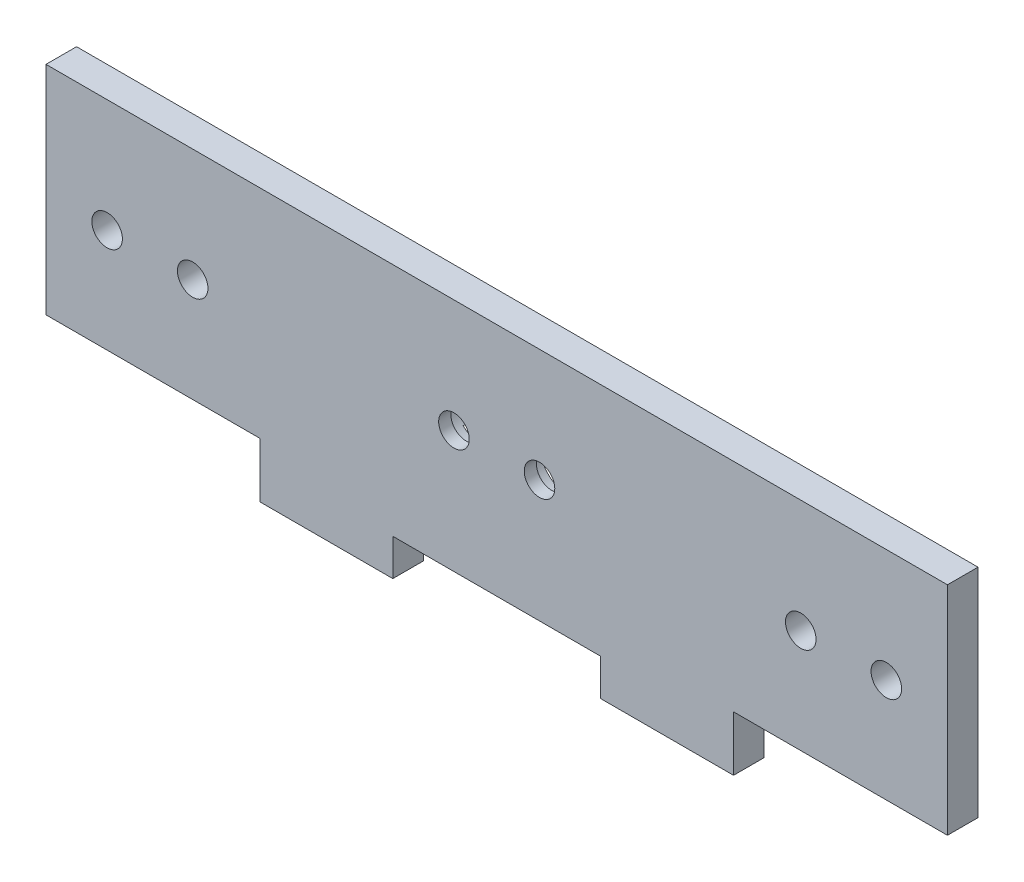
ISO-10303-21;
HEADER;
FILE_DESCRIPTION(('STEP AP214'),'2;1');
FILE_NAME('part.step','',(''),(''),'','','');
FILE_SCHEMA(('AUTOMOTIVE_DESIGN { 1 0 10303 214 1 1 1 1 }'));
ENDSEC;
DATA;
#1=APPLICATION_CONTEXT('core data for automotive mechanical design processes');
#2=APPLICATION_PROTOCOL_DEFINITION('international standard','automotive_design',2000,#1);
#3=PRODUCT_CONTEXT('',#1,'mechanical');
#4=PRODUCT('Part','Part','',(#3));
#5=PRODUCT_RELATED_PRODUCT_CATEGORY('part','',(#4));
#6=PRODUCT_DEFINITION_FORMATION('','',#4);
#7=PRODUCT_DEFINITION_CONTEXT('part definition',#1,'design');
#8=PRODUCT_DEFINITION('design','',#6,#7);
#9=PRODUCT_DEFINITION_SHAPE('','',#8);
#10=(LENGTH_UNIT() NAMED_UNIT(*) SI_UNIT(.MILLI.,.METRE.));
#11=(NAMED_UNIT(*) PLANE_ANGLE_UNIT() SI_UNIT($,.RADIAN.));
#12=(NAMED_UNIT(*) SI_UNIT($,.STERADIAN.) SOLID_ANGLE_UNIT());
#13=UNCERTAINTY_MEASURE_WITH_UNIT(LENGTH_MEASURE(1.E-05),#10,'distance_accuracy_value','');
#14=(GEOMETRIC_REPRESENTATION_CONTEXT(3) GLOBAL_UNCERTAINTY_ASSIGNED_CONTEXT((#13)) GLOBAL_UNIT_ASSIGNED_CONTEXT((#10,
#11,#12)) REPRESENTATION_CONTEXT('',''));
#15=CARTESIAN_POINT('',(0.,0.,0.));
#16=DIRECTION('',(0.,0.,1.));
#17=DIRECTION('',(1.,0.,0.));
#18=AXIS2_PLACEMENT_3D('',#15,#16,#17);
#19=CARTESIAN_POINT('',(7.00000000000001,8.24999999999915,-7.));
#20=DIRECTION('',(0.,0.,1.));
#21=DIRECTION('',(1.,0.,0.));
#22=AXIS2_PLACEMENT_3D('',#19,#20,#21);
#23=CYLINDRICAL_SURFACE('',#22,2.5);
#24=CARTESIAN_POINT('',(7.00000000000001,8.24999999999915,5.));
#25=DIRECTION('',(0.,0.,1.));
#26=DIRECTION('',(1.,0.,0.));
#27=AXIS2_PLACEMENT_3D('',#24,#25,#26);
#28=CIRCLE('',#27,2.5);
#29=CARTESIAN_POINT('',(9.50000000000001,8.24999999999915,5.));
#30=VERTEX_POINT('',#29);
#31=EDGE_CURVE('E329',#30,#30,#28,.T.);
#32=ORIENTED_EDGE('',*,*,#31,.T.);
#33=EDGE_LOOP('',(#32));
#34=FACE_BOUND('',#33,.T.);
#35=CARTESIAN_POINT('',(7.00000000000001,8.24999999999915,3.));
#36=DIRECTION('',(0.,0.,-1.));
#37=DIRECTION('',(-1.,0.,0.));
#38=AXIS2_PLACEMENT_3D('',#35,#36,#37);
#39=CIRCLE('',#38,2.5);
#40=CARTESIAN_POINT('',(4.50000000000001,8.24999999999915,3.));
#41=VERTEX_POINT('',#40);
#42=EDGE_CURVE('E283',#41,#41,#39,.F.);
#43=ORIENTED_EDGE('',*,*,#42,.F.);
#44=EDGE_LOOP('',(#43));
#45=FACE_BOUND('',#44,.T.);
#46=ADVANCED_FACE('F45',(#34,#45),#23,.F.);
#47=CARTESIAN_POINT('',(-6.99999999999999,8.24999999999906,-7.));
#48=DIRECTION('',(0.,0.,1.));
#49=DIRECTION('',(1.,0.,0.));
#50=AXIS2_PLACEMENT_3D('',#47,#48,#49);
#51=CYLINDRICAL_SURFACE('',#50,2.5);
#52=CARTESIAN_POINT('',(-6.99999999999999,8.24999999999906,5.));
#53=DIRECTION('',(0.,0.,1.));
#54=DIRECTION('',(1.,0.,0.));
#55=AXIS2_PLACEMENT_3D('',#52,#53,#54);
#56=CIRCLE('',#55,2.5);
#57=CARTESIAN_POINT('',(-4.49999999999999,8.24999999999906,5.));
#58=VERTEX_POINT('',#57);
#59=EDGE_CURVE('E320',#58,#58,#56,.T.);
#60=ORIENTED_EDGE('',*,*,#59,.T.);
#61=EDGE_LOOP('',(#60));
#62=FACE_BOUND('',#61,.T.);
#63=CARTESIAN_POINT('',(-6.99999999999999,8.24999999999906,3.));
#64=DIRECTION('',(0.,0.,-1.));
#65=DIRECTION('',(-1.,0.,0.));
#66=AXIS2_PLACEMENT_3D('',#63,#64,#65);
#67=CIRCLE('',#66,2.5);
#68=CARTESIAN_POINT('',(-9.49999999999999,8.24999999999906,3.));
#69=VERTEX_POINT('',#68);
#70=EDGE_CURVE('E280',#69,#69,#67,.F.);
#71=ORIENTED_EDGE('',*,*,#70,.F.);
#72=EDGE_LOOP('',(#71));
#73=FACE_BOUND('',#72,.T.);
#74=ADVANCED_FACE('F436',(#62,#73),#51,.F.);
#75=CARTESIAN_POINT('',(73.75,26.75,5.));
#76=DIRECTION('',(-1.,0.,0.));
#77=DIRECTION('',(0.,0.,1.));
#78=AXIS2_PLACEMENT_3D('',#75,#76,#77);
#79=PLANE('',#78);
#80=DIRECTION('',(0.,1.,0.));
#81=VECTOR('',#80,1.);
#82=CARTESIAN_POINT('',(73.75,26.75,5.));
#83=LINE('',#82,#81);
#84=CARTESIAN_POINT('',(73.75,-8.75,5.));
#85=VERTEX_POINT('',#84);
#86=CARTESIAN_POINT('',(73.75,26.75,5.));
#87=VERTEX_POINT('',#86);
#88=EDGE_CURVE('E203',#85,#87,#83,.T.);
#89=ORIENTED_EDGE('',*,*,#88,.F.);
#90=DIRECTION('',(0.,0.,1.));
#91=VECTOR('',#90,1.);
#92=CARTESIAN_POINT('',(73.75,-8.75,-7.));
#93=LINE('',#92,#91);
#94=CARTESIAN_POINT('',(73.75,-8.75,0.));
#95=VERTEX_POINT('',#94);
#96=EDGE_CURVE('E184',#95,#85,#93,.T.);
#97=ORIENTED_EDGE('',*,*,#96,.F.);
#98=DIRECTION('',(0.,1.,0.));
#99=VECTOR('',#98,1.);
#100=CARTESIAN_POINT('',(73.75,26.75,0.));
#101=LINE('',#100,#99);
#102=CARTESIAN_POINT('',(73.75,26.75,0.));
#103=VERTEX_POINT('',#102);
#104=EDGE_CURVE('E202',#95,#103,#101,.T.);
#105=ORIENTED_EDGE('',*,*,#104,.T.);
#106=DIRECTION('',(0.,0.,-1.));
#107=VECTOR('',#106,1.);
#108=CARTESIAN_POINT('',(73.75,26.75,5.));
#109=LINE('',#108,#107);
#110=EDGE_CURVE('E226',#87,#103,#109,.T.);
#111=ORIENTED_EDGE('',*,*,#110,.F.);
#112=EDGE_LOOP('',(#89,#97,#105,#111));
#113=FACE_BOUND('',#112,.T.);
#114=ADVANCED_FACE('F47',(#113),#79,.F.);
#115=CARTESIAN_POINT('',(-73.75,26.75,5.));
#116=DIRECTION('',(0.,-1.,0.));
#117=DIRECTION('',(0.,0.,-1.));
#118=AXIS2_PLACEMENT_3D('',#115,#116,#117);
#119=PLANE('',#118);
#120=DIRECTION('',(-1.,0.,0.));
#121=VECTOR('',#120,1.);
#122=CARTESIAN_POINT('',(-73.75,26.75,0.));
#123=LINE('',#122,#121);
#124=CARTESIAN_POINT('',(-73.75,26.75,0.));
#125=VERTEX_POINT('',#124);
#126=EDGE_CURVE('E217',#103,#125,#123,.T.);
#127=ORIENTED_EDGE('',*,*,#126,.T.);
#128=DIRECTION('',(0.,0.,-1.));
#129=VECTOR('',#128,1.);
#130=CARTESIAN_POINT('',(-73.75,26.75,5.));
#131=LINE('',#130,#129);
#132=CARTESIAN_POINT('',(-73.75,26.75,5.));
#133=VERTEX_POINT('',#132);
#134=EDGE_CURVE('E214',#133,#125,#131,.T.);
#135=ORIENTED_EDGE('',*,*,#134,.F.);
#136=DIRECTION('',(-1.,0.,0.));
#137=VECTOR('',#136,1.);
#138=CARTESIAN_POINT('',(-73.75,26.75,5.));
#139=LINE('',#138,#137);
#140=EDGE_CURVE('E206',#87,#133,#139,.T.);
#141=ORIENTED_EDGE('',*,*,#140,.F.);
#142=ORIENTED_EDGE('',*,*,#110,.T.);
#143=EDGE_LOOP('',(#127,#135,#141,#142));
#144=FACE_BOUND('',#143,.T.);
#145=ADVANCED_FACE('F488',(#144),#119,.F.);
#146=CARTESIAN_POINT('',(-73.75,26.75,5.));
#147=DIRECTION('',(1.,0.,0.));
#148=DIRECTION('',(0.,0.,-1.));
#149=AXIS2_PLACEMENT_3D('',#146,#147,#148);
#150=PLANE('',#149);
#151=DIRECTION('',(0.,-1.,0.));
#152=VECTOR('',#151,1.);
#153=CARTESIAN_POINT('',(-73.75,26.75,0.));
#154=LINE('',#153,#152);
#155=CARTESIAN_POINT('',(-73.75,-8.75,0.));
#156=VERTEX_POINT('',#155);
#157=EDGE_CURVE('E207',#125,#156,#154,.T.);
#158=ORIENTED_EDGE('',*,*,#157,.T.);
#159=DIRECTION('',(0.,0.,1.));
#160=VECTOR('',#159,1.);
#161=CARTESIAN_POINT('',(-73.75,-8.75,-7.));
#162=LINE('',#161,#160);
#163=CARTESIAN_POINT('',(-73.75,-8.75,5.));
#164=VERTEX_POINT('',#163);
#165=EDGE_CURVE('E198',#156,#164,#162,.T.);
#166=ORIENTED_EDGE('',*,*,#165,.T.);
#167=DIRECTION('',(0.,-1.,0.));
#168=VECTOR('',#167,1.);
#169=CARTESIAN_POINT('',(-73.75,26.75,5.));
#170=LINE('',#169,#168);
#171=EDGE_CURVE('E210',#133,#164,#170,.T.);
#172=ORIENTED_EDGE('',*,*,#171,.F.);
#173=ORIENTED_EDGE('',*,*,#134,.T.);
#174=EDGE_LOOP('',(#158,#166,#172,#173));
#175=FACE_BOUND('',#174,.T.);
#176=ADVANCED_FACE('F383',(#175),#150,.F.);
#177=CARTESIAN_POINT('',(0.,0.,5.));
#178=DIRECTION('',(0.,0.,1.));
#179=DIRECTION('',(1.,0.,0.));
#180=AXIS2_PLACEMENT_3D('',#177,#178,#179);
#181=PLANE('',#180);
#182=DIRECTION('',(-1.,0.,0.));
#183=VECTOR('',#182,1.);
#184=CARTESIAN_POINT('',(-38.75,-17.75,5.));
#185=LINE('',#184,#183);
#186=CARTESIAN_POINT('',(38.75,-17.75,5.));
#187=VERTEX_POINT('',#186);
#188=CARTESIAN_POINT('',(17.,-17.75,5.));
#189=VERTEX_POINT('',#188);
#190=EDGE_CURVE('E69',#187,#189,#185,.T.);
#191=ORIENTED_EDGE('',*,*,#190,.F.);
#192=DIRECTION('',(0.,-1.,0.));
#193=VECTOR('',#192,1.);
#194=CARTESIAN_POINT('',(38.75,-26.75,5.));
#195=LINE('',#194,#193);
#196=CARTESIAN_POINT('',(38.75,-8.75,5.));
#197=VERTEX_POINT('',#196);
#198=EDGE_CURVE('E173',#197,#187,#195,.T.);
#199=ORIENTED_EDGE('',*,*,#198,.F.);
#200=DIRECTION('',(-1.,0.,0.));
#201=VECTOR('',#200,1.);
#202=CARTESIAN_POINT('',(73.75,-8.75,5.));
#203=LINE('',#202,#201);
#204=EDGE_CURVE('E183',#85,#197,#203,.T.);
#205=ORIENTED_EDGE('',*,*,#204,.F.);
#206=ORIENTED_EDGE('',*,*,#88,.T.);
#207=ORIENTED_EDGE('',*,*,#140,.T.);
#208=ORIENTED_EDGE('',*,*,#171,.T.);
#209=DIRECTION('',(-1.,0.,0.));
#210=VECTOR('',#209,1.);
#211=CARTESIAN_POINT('',(-73.75,-8.75,5.));
#212=LINE('',#211,#210);
#213=CARTESIAN_POINT('',(-38.75,-8.75,5.));
#214=VERTEX_POINT('',#213);
#215=EDGE_CURVE('E361',#214,#164,#212,.T.);
#216=ORIENTED_EDGE('',*,*,#215,.F.);
#217=DIRECTION('',(0.,1.,0.));
#218=VECTOR('',#217,1.);
#219=CARTESIAN_POINT('',(-38.75,-26.75,5.));
#220=LINE('',#219,#218);
#221=CARTESIAN_POINT('',(-38.75,-17.75,5.));
#222=VERTEX_POINT('',#221);
#223=EDGE_CURVE('E188',#222,#214,#220,.T.);
#224=ORIENTED_EDGE('',*,*,#223,.F.);
#225=CARTESIAN_POINT('',(-17.,-17.75,5.));
#226=VERTEX_POINT('',#225);
#227=EDGE_CURVE('E177',#226,#222,#185,.T.);
#228=ORIENTED_EDGE('',*,*,#227,.F.);
#229=DIRECTION('',(0.,-1.,0.));
#230=VECTOR('',#229,1.);
#231=CARTESIAN_POINT('',(-17.,-11.75,5.));
#232=LINE('',#231,#230);
#233=CARTESIAN_POINT('',(-17.,-11.75,5.));
#234=VERTEX_POINT('',#233);
#235=EDGE_CURVE('E279',#234,#226,#232,.T.);
#236=ORIENTED_EDGE('',*,*,#235,.F.);
#237=DIRECTION('',(-1.,0.,0.));
#238=VECTOR('',#237,1.);
#239=CARTESIAN_POINT('',(-17.,-11.75,5.));
#240=LINE('',#239,#238);
#241=CARTESIAN_POINT('',(17.,-11.75,5.));
#242=VERTEX_POINT('',#241);
#243=EDGE_CURVE('E348',#242,#234,#240,.T.);
#244=ORIENTED_EDGE('',*,*,#243,.F.);
#245=DIRECTION('',(0.,1.,0.));
#246=VECTOR('',#245,1.);
#247=CARTESIAN_POINT('',(17.,-11.75,5.));
#248=LINE('',#247,#246);
#249=EDGE_CURVE('E175',#189,#242,#248,.T.);
#250=ORIENTED_EDGE('',*,*,#249,.F.);
#251=EDGE_LOOP('',(#191,#199,#205,#206,#207,#208,#216,#224,#228,#236,#244,#250));
#252=FACE_BOUND('',#251,.T.);
#253=CARTESIAN_POINT('',(63.75,8.24999999999915,5.));
#254=DIRECTION('',(0.,0.,1.));
#255=DIRECTION('',(1.,0.,0.));
#256=AXIS2_PLACEMENT_3D('',#253,#254,#255);
#257=CIRCLE('',#256,2.50000000000001);
#258=CARTESIAN_POINT('',(66.25,8.24999999999915,5.));
#259=VERTEX_POINT('',#258);
#260=EDGE_CURVE('E325',#259,#259,#257,.T.);
#261=ORIENTED_EDGE('',*,*,#260,.F.);
#262=EDGE_LOOP('',(#261));
#263=FACE_BOUND('',#262,.T.);
#264=ORIENTED_EDGE('',*,*,#31,.F.);
#265=EDGE_LOOP('',(#264));
#266=FACE_BOUND('',#265,.T.);
#267=CARTESIAN_POINT('',(-49.75,8.24999999999915,5.));
#268=DIRECTION('',(0.,0.,1.));
#269=DIRECTION('',(-1.,0.,0.));
#270=AXIS2_PLACEMENT_3D('',#267,#268,#269);
#271=CIRCLE('',#270,2.5);
#272=CARTESIAN_POINT('',(-52.25,8.24999999999915,5.));
#273=VERTEX_POINT('',#272);
#274=EDGE_CURVE('E333',#273,#273,#271,.T.);
#275=ORIENTED_EDGE('',*,*,#274,.F.);
#276=EDGE_LOOP('',(#275));
#277=FACE_BOUND('',#276,.T.);
#278=CARTESIAN_POINT('',(-63.75,8.24999999999915,5.));
#279=DIRECTION('',(0.,0.,1.));
#280=DIRECTION('',(-1.,0.,0.));
#281=AXIS2_PLACEMENT_3D('',#278,#279,#280);
#282=CIRCLE('',#281,2.50000000000001);
#283=CARTESIAN_POINT('',(-66.25,8.24999999999915,5.));
#284=VERTEX_POINT('',#283);
#285=EDGE_CURVE('E324',#284,#284,#282,.T.);
#286=ORIENTED_EDGE('',*,*,#285,.F.);
#287=EDGE_LOOP('',(#286));
#288=FACE_BOUND('',#287,.T.);
#289=ORIENTED_EDGE('',*,*,#59,.F.);
#290=EDGE_LOOP('',(#289));
#291=FACE_BOUND('',#290,.T.);
#292=CARTESIAN_POINT('',(49.75,8.24999999999915,5.));
#293=DIRECTION('',(0.,0.,1.));
#294=DIRECTION('',(1.,0.,0.));
#295=AXIS2_PLACEMENT_3D('',#292,#293,#294);
#296=CIRCLE('',#295,2.5);
#297=CARTESIAN_POINT('',(52.25,8.24999999999915,5.));
#298=VERTEX_POINT('',#297);
#299=EDGE_CURVE('E267',#298,#298,#296,.T.);
#300=ORIENTED_EDGE('',*,*,#299,.F.);
#301=EDGE_LOOP('',(#300));
#302=FACE_BOUND('',#301,.T.);
#303=ADVANCED_FACE('F170',(#252,#263,#266,#277,#288,#291,#302),#181,.T.);
#304=CARTESIAN_POINT('',(0.,0.,0.));
#305=DIRECTION('',(0.,0.,1.));
#306=DIRECTION('',(1.,0.,0.));
#307=AXIS2_PLACEMENT_3D('',#304,#305,#306);
#308=PLANE('',#307);
#309=CARTESIAN_POINT('',(63.75,8.24999999999915,0.));
#310=DIRECTION('',(0.,0.,1.));
#311=DIRECTION('',(1.,0.,0.));
#312=AXIS2_PLACEMENT_3D('',#309,#310,#311);
#313=CIRCLE('',#312,2.50000000000001);
#314=CARTESIAN_POINT('',(66.25,8.24999999999915,0.));
#315=VERTEX_POINT('',#314);
#316=EDGE_CURVE('E275',#315,#315,#313,.T.);
#317=ORIENTED_EDGE('',*,*,#316,.T.);
#318=EDGE_LOOP('',(#317));
#319=FACE_BOUND('',#318,.T.);
#320=CARTESIAN_POINT('',(-49.75,8.24999999999915,0.));
#321=DIRECTION('',(0.,0.,1.));
#322=DIRECTION('',(1.,0.,0.));
#323=AXIS2_PLACEMENT_3D('',#320,#321,#322);
#324=CIRCLE('',#323,2.5);
#325=CARTESIAN_POINT('',(-47.25,8.24999999999915,0.));
#326=VERTEX_POINT('',#325);
#327=EDGE_CURVE('E271',#326,#326,#324,.T.);
#328=ORIENTED_EDGE('',*,*,#327,.T.);
#329=EDGE_LOOP('',(#328));
#330=FACE_BOUND('',#329,.T.);
#331=CARTESIAN_POINT('',(-63.75,8.24999999999915,0.));
#332=DIRECTION('',(0.,0.,1.));
#333=DIRECTION('',(1.,0.,0.));
#334=AXIS2_PLACEMENT_3D('',#331,#332,#333);
#335=CIRCLE('',#334,2.50000000000001);
#336=CARTESIAN_POINT('',(-61.25,8.24999999999915,0.));
#337=VERTEX_POINT('',#336);
#338=EDGE_CURVE('E266',#337,#337,#335,.T.);
#339=ORIENTED_EDGE('',*,*,#338,.T.);
#340=EDGE_LOOP('',(#339));
#341=FACE_BOUND('',#340,.T.);
#342=CARTESIAN_POINT('',(49.75,8.24999999999915,0.));
#343=DIRECTION('',(0.,0.,1.));
#344=DIRECTION('',(1.,0.,0.));
#345=AXIS2_PLACEMENT_3D('',#342,#343,#344);
#346=CIRCLE('',#345,2.5);
#347=CARTESIAN_POINT('',(52.25,8.24999999999915,0.));
#348=VERTEX_POINT('',#347);
#349=EDGE_CURVE('E262',#348,#348,#346,.T.);
#350=ORIENTED_EDGE('',*,*,#349,.T.);
#351=EDGE_LOOP('',(#350));
#352=FACE_BOUND('',#351,.T.);
#353=CARTESIAN_POINT('',(12.5,9.24999999999983,0.));
#354=DIRECTION('',(0.,0.,1.));
#355=DIRECTION('',(1.,0.,0.));
#356=AXIS2_PLACEMENT_3D('',#353,#354,#355);
#357=CIRCLE('',#356,5.);
#358=CARTESIAN_POINT('',(9.00838015128996,12.828909167902,0.));
#359=VERTEX_POINT('',#358);
#360=CARTESIAN_POINT('',(10.4916198487101,4.671090832097,0.));
#361=VERTEX_POINT('',#360);
#362=EDGE_CURVE('E234',#359,#361,#357,.F.);
#363=ORIENTED_EDGE('',*,*,#362,.F.);
#364=CARTESIAN_POINT('',(7.00000000000001,8.24999999999915,0.));
#365=DIRECTION('',(0.,0.,1.));
#366=DIRECTION('',(1.,0.,0.));
#367=AXIS2_PLACEMENT_3D('',#364,#365,#366);
#368=CIRCLE('',#367,5.);
#369=EDGE_CURVE('E292',#359,#361,#368,.T.);
#370=ORIENTED_EDGE('',*,*,#369,.T.);
#371=EDGE_LOOP('',(#363,#370));
#372=FACE_BOUND('',#371,.T.);
#373=CARTESIAN_POINT('',(-12.5,9.25,0.));
#374=DIRECTION('',(0.,0.,1.));
#375=DIRECTION('',(1.,0.,0.));
#376=AXIS2_PLACEMENT_3D('',#373,#374,#375);
#377=CIRCLE('',#376,5.);
#378=CARTESIAN_POINT('',(-10.4916198487102,4.6710908320971,0.));
#379=VERTEX_POINT('',#378);
#380=CARTESIAN_POINT('',(-9.00838015128977,12.828909167902,0.));
#381=VERTEX_POINT('',#380);
#382=EDGE_CURVE('E230',#379,#381,#377,.F.);
#383=ORIENTED_EDGE('',*,*,#382,.F.);
#384=CARTESIAN_POINT('',(-6.99999999999999,8.24999999999906,0.));
#385=DIRECTION('',(0.,0.,1.));
#386=DIRECTION('',(1.,0.,0.));
#387=AXIS2_PLACEMENT_3D('',#384,#385,#386);
#388=CIRCLE('',#387,5.);
#389=EDGE_CURVE('E312',#379,#381,#388,.T.);
#390=ORIENTED_EDGE('',*,*,#389,.T.);
#391=EDGE_LOOP('',(#383,#390));
#392=FACE_BOUND('',#391,.T.);
#393=DIRECTION('',(0.,-1.,0.));
#394=VECTOR('',#393,1.);
#395=CARTESIAN_POINT('',(38.75,0.,0.));
#396=LINE('',#395,#394);
#397=CARTESIAN_POINT('',(38.75,-8.75,0.));
#398=VERTEX_POINT('',#397);
#399=CARTESIAN_POINT('',(38.75,-17.75,0.));
#400=VERTEX_POINT('',#399);
#401=EDGE_CURVE('E242',#398,#400,#396,.T.);
#402=ORIENTED_EDGE('',*,*,#401,.T.);
#403=DIRECTION('',(-1.,0.,0.));
#404=VECTOR('',#403,1.);
#405=CARTESIAN_POINT('',(0.,-17.75,0.));
#406=LINE('',#405,#404);
#407=CARTESIAN_POINT('',(17.,-17.75,0.));
#408=VERTEX_POINT('',#407);
#409=EDGE_CURVE('E159',#400,#408,#406,.T.);
#410=ORIENTED_EDGE('',*,*,#409,.T.);
#411=DIRECTION('',(0.,1.,0.));
#412=VECTOR('',#411,1.);
#413=CARTESIAN_POINT('',(17.,0.,0.));
#414=LINE('',#413,#412);
#415=CARTESIAN_POINT('',(17.,-11.75,0.));
#416=VERTEX_POINT('',#415);
#417=EDGE_CURVE('E252',#408,#416,#414,.T.);
#418=ORIENTED_EDGE('',*,*,#417,.T.);
#419=DIRECTION('',(-1.,0.,0.));
#420=VECTOR('',#419,1.);
#421=CARTESIAN_POINT('',(0.,-11.75,0.));
#422=LINE('',#421,#420);
#423=CARTESIAN_POINT('',(-17.,-11.75,0.));
#424=VERTEX_POINT('',#423);
#425=EDGE_CURVE('E255',#416,#424,#422,.T.);
#426=ORIENTED_EDGE('',*,*,#425,.T.);
#427=DIRECTION('',(0.,-1.,0.));
#428=VECTOR('',#427,1.);
#429=CARTESIAN_POINT('',(-17.,0.,0.));
#430=LINE('',#429,#428);
#431=CARTESIAN_POINT('',(-17.,-17.75,0.));
#432=VERTEX_POINT('',#431);
#433=EDGE_CURVE('E54',#424,#432,#430,.T.);
#434=ORIENTED_EDGE('',*,*,#433,.T.);
#435=CARTESIAN_POINT('',(-38.75,-17.75,0.));
#436=VERTEX_POINT('',#435);
#437=EDGE_CURVE('E61',#432,#436,#406,.T.);
#438=ORIENTED_EDGE('',*,*,#437,.T.);
#439=DIRECTION('',(0.,1.,0.));
#440=VECTOR('',#439,1.);
#441=CARTESIAN_POINT('',(-38.75,0.,0.));
#442=LINE('',#441,#440);
#443=CARTESIAN_POINT('',(-38.75,-8.75,0.));
#444=VERTEX_POINT('',#443);
#445=EDGE_CURVE('E245',#436,#444,#442,.T.);
#446=ORIENTED_EDGE('',*,*,#445,.T.);
#447=DIRECTION('',(-1.,0.,0.));
#448=VECTOR('',#447,1.);
#449=CARTESIAN_POINT('',(0.,-8.75,0.));
#450=LINE('',#449,#448);
#451=EDGE_CURVE('E248',#444,#156,#450,.T.);
#452=ORIENTED_EDGE('',*,*,#451,.T.);
#453=ORIENTED_EDGE('',*,*,#157,.F.);
#454=ORIENTED_EDGE('',*,*,#126,.F.);
#455=ORIENTED_EDGE('',*,*,#104,.F.);
#456=DIRECTION('',(-1.,0.,0.));
#457=VECTOR('',#456,1.);
#458=CARTESIAN_POINT('',(0.,-8.75,0.));
#459=LINE('',#458,#457);
#460=EDGE_CURVE('E238',#95,#398,#459,.T.);
#461=ORIENTED_EDGE('',*,*,#460,.T.);
#462=EDGE_LOOP('',(#402,#410,#418,#426,#434,#438,#446,#452,#453,#454,#455,#461));
#463=FACE_BOUND('',#462,.T.);
#464=ADVANCED_FACE('F386',(#319,#330,#341,#352,#372,#392,#463),#308,.F.);
#465=CARTESIAN_POINT('',(-12.5,9.25,-7.));
#466=DIRECTION('',(0.,0.,1.));
#467=DIRECTION('',(1.,0.,0.));
#468=AXIS2_PLACEMENT_3D('',#465,#466,#467);
#469=CYLINDRICAL_SURFACE('',#468,5.);
#470=ORIENTED_EDGE('',*,*,#382,.T.);
#471=DIRECTION('',(0.,0.,-1.));
#472=VECTOR('',#471,1.);
#473=CARTESIAN_POINT('',(-9.00838015128977,12.828909167902,-2.));
#474=LINE('',#473,#472);
#475=CARTESIAN_POINT('',(-9.00838015128977,12.828909167902,-7.));
#476=VERTEX_POINT('',#475);
#477=EDGE_CURVE('E316',#381,#476,#474,.T.);
#478=ORIENTED_EDGE('',*,*,#477,.T.);
#479=CARTESIAN_POINT('',(-12.5,9.25,-7.));
#480=DIRECTION('',(0.,0.,-1.));
#481=DIRECTION('',(-1.,0.,0.));
#482=AXIS2_PLACEMENT_3D('',#479,#480,#481);
#483=CIRCLE('',#482,5.);
#484=CARTESIAN_POINT('',(-10.4916198487102,4.6710908320971,-7.));
#485=VERTEX_POINT('',#484);
#486=EDGE_CURVE('E197',#485,#476,#483,.T.);
#487=ORIENTED_EDGE('',*,*,#486,.F.);
#488=DIRECTION('',(0.,0.,-1.));
#489=VECTOR('',#488,1.);
#490=CARTESIAN_POINT('',(-10.4916198487102,4.6710908320971,-2.));
#491=LINE('',#490,#489);
#492=EDGE_CURVE('E308',#485,#379,#491,.F.);
#493=ORIENTED_EDGE('',*,*,#492,.T.);
#494=EDGE_LOOP('',(#470,#478,#487,#493));
#495=FACE_BOUND('',#494,.T.);
#496=ADVANCED_FACE('F528',(#495),#469,.T.);
#497=CARTESIAN_POINT('',(-12.5,9.25,-7.));
#498=DIRECTION('',(0.,0.,-1.));
#499=DIRECTION('',(-1.,0.,0.));
#500=AXIS2_PLACEMENT_3D('',#497,#498,#499);
#501=PLANE('',#500);
#502=CARTESIAN_POINT('',(-6.99999999999999,8.24999999999906,-7.));
#503=DIRECTION('',(0.,0.,-1.));
#504=DIRECTION('',(-1.,0.,0.));
#505=AXIS2_PLACEMENT_3D('',#502,#503,#504);
#506=CIRCLE('',#505,5.);
#507=EDGE_CURVE('E401',#485,#476,#506,.T.);
#508=ORIENTED_EDGE('',*,*,#507,.F.);
#509=ORIENTED_EDGE('',*,*,#486,.T.);
#510=EDGE_LOOP('',(#508,#509));
#511=FACE_BOUND('',#510,.T.);
#512=ADVANCED_FACE('F432',(#511),#501,.T.);
#513=CARTESIAN_POINT('',(12.5,9.24999999999983,-7.));
#514=DIRECTION('',(0.,0.,1.));
#515=DIRECTION('',(1.,0.,0.));
#516=AXIS2_PLACEMENT_3D('',#513,#514,#515);
#517=CYLINDRICAL_SURFACE('',#516,5.);
#518=ORIENTED_EDGE('',*,*,#362,.T.);
#519=DIRECTION('',(0.,0.,-1.));
#520=VECTOR('',#519,1.);
#521=CARTESIAN_POINT('',(10.4916198487101,4.671090832097,-2.));
#522=LINE('',#521,#520);
#523=CARTESIAN_POINT('',(10.4916198487101,4.671090832097,-7.));
#524=VERTEX_POINT('',#523);
#525=EDGE_CURVE('E299',#361,#524,#522,.T.);
#526=ORIENTED_EDGE('',*,*,#525,.T.);
#527=CARTESIAN_POINT('',(12.5,9.24999999999983,-7.));
#528=DIRECTION('',(0.,0.,-1.));
#529=DIRECTION('',(-1.,0.,0.));
#530=AXIS2_PLACEMENT_3D('',#527,#528,#529);
#531=CIRCLE('',#530,5.);
#532=CARTESIAN_POINT('',(9.00838015128996,12.828909167902,-7.));
#533=VERTEX_POINT('',#532);
#534=EDGE_CURVE('E193',#533,#524,#531,.T.);
#535=ORIENTED_EDGE('',*,*,#534,.F.);
#536=DIRECTION('',(0.,0.,-1.));
#537=VECTOR('',#536,1.);
#538=CARTESIAN_POINT('',(9.00838015128996,12.828909167902,-2.));
#539=LINE('',#538,#537);
#540=EDGE_CURVE('E287',#533,#359,#539,.F.);
#541=ORIENTED_EDGE('',*,*,#540,.T.);
#542=EDGE_LOOP('',(#518,#526,#535,#541));
#543=FACE_BOUND('',#542,.T.);
#544=ADVANCED_FACE('F420',(#543),#517,.T.);
#545=CARTESIAN_POINT('',(12.5,9.24999999999983,-7.));
#546=DIRECTION('',(0.,0.,-1.));
#547=DIRECTION('',(-1.,0.,0.));
#548=AXIS2_PLACEMENT_3D('',#545,#546,#547);
#549=PLANE('',#548);
#550=CARTESIAN_POINT('',(7.00000000000001,8.24999999999915,-7.));
#551=DIRECTION('',(0.,0.,-1.));
#552=DIRECTION('',(-1.,0.,0.));
#553=AXIS2_PLACEMENT_3D('',#550,#551,#552);
#554=CIRCLE('',#553,5.);
#555=EDGE_CURVE('E403',#533,#524,#554,.T.);
#556=ORIENTED_EDGE('',*,*,#555,.F.);
#557=ORIENTED_EDGE('',*,*,#534,.T.);
#558=EDGE_LOOP('',(#556,#557));
#559=FACE_BOUND('',#558,.T.);
#560=ADVANCED_FACE('F422',(#559),#549,.T.);
#561=CARTESIAN_POINT('',(38.75,-26.75,-7.));
#562=DIRECTION('',(-1.,0.,0.));
#563=DIRECTION('',(0.,0.,1.));
#564=AXIS2_PLACEMENT_3D('',#561,#562,#563);
#565=PLANE('',#564);
#566=ORIENTED_EDGE('',*,*,#198,.T.);
#567=DIRECTION('',(0.,0.,1.));
#568=VECTOR('',#567,1.);
#569=CARTESIAN_POINT('',(38.75,-17.75,-5.));
#570=LINE('',#569,#568);
#571=EDGE_CURVE('E156',#400,#187,#570,.T.);
#572=ORIENTED_EDGE('',*,*,#571,.F.);
#573=ORIENTED_EDGE('',*,*,#401,.F.);
#574=DIRECTION('',(0.,0.,1.));
#575=VECTOR('',#574,1.);
#576=CARTESIAN_POINT('',(38.75,-8.75,-7.));
#577=LINE('',#576,#575);
#578=EDGE_CURVE('E180',#398,#197,#577,.T.);
#579=ORIENTED_EDGE('',*,*,#578,.T.);
#580=EDGE_LOOP('',(#566,#572,#573,#579));
#581=FACE_BOUND('',#580,.T.);
#582=ADVANCED_FACE('F179',(#581),#565,.F.);
#583=CARTESIAN_POINT('',(73.75,-8.75,-7.));
#584=DIRECTION('',(0.,1.,0.));
#585=DIRECTION('',(0.,0.,1.));
#586=AXIS2_PLACEMENT_3D('',#583,#584,#585);
#587=PLANE('',#586);
#588=ORIENTED_EDGE('',*,*,#96,.T.);
#589=ORIENTED_EDGE('',*,*,#204,.T.);
#590=ORIENTED_EDGE('',*,*,#578,.F.);
#591=ORIENTED_EDGE('',*,*,#460,.F.);
#592=EDGE_LOOP('',(#588,#589,#590,#591));
#593=FACE_BOUND('',#592,.T.);
#594=ADVANCED_FACE('F430',(#593),#587,.F.);
#595=CARTESIAN_POINT('',(-73.75,-8.75,-7.));
#596=DIRECTION('',(0.,1.,0.));
#597=DIRECTION('',(0.,0.,1.));
#598=AXIS2_PLACEMENT_3D('',#595,#596,#597);
#599=PLANE('',#598);
#600=DIRECTION('',(0.,0.,1.));
#601=VECTOR('',#600,1.);
#602=CARTESIAN_POINT('',(-38.75,-8.75,-7.));
#603=LINE('',#602,#601);
#604=EDGE_CURVE('E364',#444,#214,#603,.T.);
#605=ORIENTED_EDGE('',*,*,#604,.T.);
#606=ORIENTED_EDGE('',*,*,#215,.T.);
#607=ORIENTED_EDGE('',*,*,#165,.F.);
#608=ORIENTED_EDGE('',*,*,#451,.F.);
#609=EDGE_LOOP('',(#605,#606,#607,#608));
#610=FACE_BOUND('',#609,.T.);
#611=ADVANCED_FACE('F374',(#610),#599,.F.);
#612=CARTESIAN_POINT('',(-38.75,-26.75,-7.));
#613=DIRECTION('',(1.,0.,0.));
#614=DIRECTION('',(0.,0.,-1.));
#615=AXIS2_PLACEMENT_3D('',#612,#613,#614);
#616=PLANE('',#615);
#617=ORIENTED_EDGE('',*,*,#445,.F.);
#618=DIRECTION('',(0.,0.,1.));
#619=VECTOR('',#618,1.);
#620=CARTESIAN_POINT('',(-38.75,-17.75,-5.));
#621=LINE('',#620,#619);
#622=EDGE_CURVE('E165',#436,#222,#621,.T.);
#623=ORIENTED_EDGE('',*,*,#622,.T.);
#624=ORIENTED_EDGE('',*,*,#223,.T.);
#625=ORIENTED_EDGE('',*,*,#604,.F.);
#626=EDGE_LOOP('',(#617,#623,#624,#625));
#627=FACE_BOUND('',#626,.T.);
#628=ADVANCED_FACE('F389',(#627),#616,.F.);
#629=CARTESIAN_POINT('',(-17.,-11.75,-5.));
#630=DIRECTION('',(-1.,0.,0.));
#631=DIRECTION('',(0.,0.,1.));
#632=AXIS2_PLACEMENT_3D('',#629,#630,#631);
#633=PLANE('',#632);
#634=ORIENTED_EDGE('',*,*,#235,.T.);
#635=DIRECTION('',(0.,0.,-1.));
#636=VECTOR('',#635,1.);
#637=CARTESIAN_POINT('',(-17.,-17.75,-5.));
#638=LINE('',#637,#636);
#639=EDGE_CURVE('E393',#226,#432,#638,.T.);
#640=ORIENTED_EDGE('',*,*,#639,.T.);
#641=ORIENTED_EDGE('',*,*,#433,.F.);
#642=DIRECTION('',(0.,0.,1.));
#643=VECTOR('',#642,1.);
#644=CARTESIAN_POINT('',(-17.,-11.75,-5.));
#645=LINE('',#644,#643);
#646=EDGE_CURVE('E353',#424,#234,#645,.T.);
#647=ORIENTED_EDGE('',*,*,#646,.T.);
#648=EDGE_LOOP('',(#634,#640,#641,#647));
#649=FACE_BOUND('',#648,.T.);
#650=ADVANCED_FACE('F465',(#649),#633,.F.);
#651=CARTESIAN_POINT('',(-17.,-11.75,-5.));
#652=DIRECTION('',(0.,1.,0.));
#653=DIRECTION('',(0.,0.,1.));
#654=AXIS2_PLACEMENT_3D('',#651,#652,#653);
#655=PLANE('',#654);
#656=DIRECTION('',(0.,0.,1.));
#657=VECTOR('',#656,1.);
#658=CARTESIAN_POINT('',(17.,-11.75,-5.));
#659=LINE('',#658,#657);
#660=EDGE_CURVE('E352',#416,#242,#659,.T.);
#661=ORIENTED_EDGE('',*,*,#660,.T.);
#662=ORIENTED_EDGE('',*,*,#243,.T.);
#663=ORIENTED_EDGE('',*,*,#646,.F.);
#664=ORIENTED_EDGE('',*,*,#425,.F.);
#665=EDGE_LOOP('',(#661,#662,#663,#664));
#666=FACE_BOUND('',#665,.T.);
#667=ADVANCED_FACE('F462',(#666),#655,.F.);
#668=CARTESIAN_POINT('',(17.,-11.75,-5.));
#669=DIRECTION('',(1.,0.,0.));
#670=DIRECTION('',(0.,0.,-1.));
#671=AXIS2_PLACEMENT_3D('',#668,#669,#670);
#672=PLANE('',#671);
#673=ORIENTED_EDGE('',*,*,#417,.F.);
#674=DIRECTION('',(0.,0.,1.));
#675=VECTOR('',#674,1.);
#676=CARTESIAN_POINT('',(17.,-17.75,-5.));
#677=LINE('',#676,#675);
#678=EDGE_CURVE('E11',#408,#189,#677,.T.);
#679=ORIENTED_EDGE('',*,*,#678,.T.);
#680=ORIENTED_EDGE('',*,*,#249,.T.);
#681=ORIENTED_EDGE('',*,*,#660,.F.);
#682=EDGE_LOOP('',(#673,#679,#680,#681));
#683=FACE_BOUND('',#682,.T.);
#684=ADVANCED_FACE('F460',(#683),#672,.F.);
#685=CARTESIAN_POINT('',(49.75,8.24999999999915,-7.));
#686=DIRECTION('',(0.,0.,1.));
#687=DIRECTION('',(1.,0.,0.));
#688=AXIS2_PLACEMENT_3D('',#685,#686,#687);
#689=CYLINDRICAL_SURFACE('',#688,2.5);
#690=ORIENTED_EDGE('',*,*,#299,.T.);
#691=EDGE_LOOP('',(#690));
#692=FACE_BOUND('',#691,.T.);
#693=ORIENTED_EDGE('',*,*,#349,.F.);
#694=EDGE_LOOP('',(#693));
#695=FACE_BOUND('',#694,.T.);
#696=ADVANCED_FACE('F456',(#692,#695),#689,.F.);
#697=CARTESIAN_POINT('',(-63.75,8.24999999999915,-7.));
#698=DIRECTION('',(0.,0.,1.));
#699=DIRECTION('',(1.,0.,0.));
#700=AXIS2_PLACEMENT_3D('',#697,#698,#699);
#701=CYLINDRICAL_SURFACE('',#700,2.50000000000001);
#702=ORIENTED_EDGE('',*,*,#285,.T.);
#703=EDGE_LOOP('',(#702));
#704=FACE_BOUND('',#703,.T.);
#705=ORIENTED_EDGE('',*,*,#338,.F.);
#706=EDGE_LOOP('',(#705));
#707=FACE_BOUND('',#706,.T.);
#708=ADVANCED_FACE('F452',(#704,#707),#701,.F.);
#709=CARTESIAN_POINT('',(-49.75,8.24999999999915,-7.));
#710=DIRECTION('',(0.,0.,1.));
#711=DIRECTION('',(1.,0.,0.));
#712=AXIS2_PLACEMENT_3D('',#709,#710,#711);
#713=CYLINDRICAL_SURFACE('',#712,2.5);
#714=ORIENTED_EDGE('',*,*,#274,.T.);
#715=EDGE_LOOP('',(#714));
#716=FACE_BOUND('',#715,.T.);
#717=ORIENTED_EDGE('',*,*,#327,.F.);
#718=EDGE_LOOP('',(#717));
#719=FACE_BOUND('',#718,.T.);
#720=ADVANCED_FACE('F449',(#716,#719),#713,.F.);
#721=CARTESIAN_POINT('',(63.75,8.24999999999915,-7.));
#722=DIRECTION('',(0.,0.,1.));
#723=DIRECTION('',(1.,0.,0.));
#724=AXIS2_PLACEMENT_3D('',#721,#722,#723);
#725=CYLINDRICAL_SURFACE('',#724,2.50000000000001);
#726=ORIENTED_EDGE('',*,*,#260,.T.);
#727=EDGE_LOOP('',(#726));
#728=FACE_BOUND('',#727,.T.);
#729=ORIENTED_EDGE('',*,*,#316,.F.);
#730=EDGE_LOOP('',(#729));
#731=FACE_BOUND('',#730,.T.);
#732=ADVANCED_FACE('F448',(#728,#731),#725,.F.);
#733=CARTESIAN_POINT('',(-6.99999999999999,8.24999999999906,3.));
#734=DIRECTION('',(0.,0.,-1.));
#735=DIRECTION('',(-1.,0.,0.));
#736=AXIS2_PLACEMENT_3D('',#733,#734,#735);
#737=CYLINDRICAL_SURFACE('',#736,5.);
#738=CARTESIAN_POINT('',(-6.99999999999999,8.24999999999906,3.));
#739=DIRECTION('',(0.,0.,-1.));
#740=DIRECTION('',(-1.,0.,0.));
#741=AXIS2_PLACEMENT_3D('',#738,#739,#740);
#742=CIRCLE('',#741,5.);
#743=CARTESIAN_POINT('',(-12.,8.24999999999906,3.));
#744=VERTEX_POINT('',#743);
#745=EDGE_CURVE('E284',#744,#744,#742,.T.);
#746=ORIENTED_EDGE('',*,*,#745,.F.);
#747=EDGE_LOOP('',(#746));
#748=FACE_BOUND('',#747,.T.);
#749=ORIENTED_EDGE('',*,*,#389,.F.);
#750=ORIENTED_EDGE('',*,*,#492,.F.);
#751=ORIENTED_EDGE('',*,*,#507,.T.);
#752=ORIENTED_EDGE('',*,*,#477,.F.);
#753=EDGE_LOOP('',(#749,#750,#751,#752));
#754=FACE_BOUND('',#753,.T.);
#755=ADVANCED_FACE('F504',(#748,#754),#737,.F.);
#756=CARTESIAN_POINT('',(-6.99999999999999,8.24999999999906,3.));
#757=DIRECTION('',(0.,0.,-1.));
#758=DIRECTION('',(-1.,0.,0.));
#759=AXIS2_PLACEMENT_3D('',#756,#757,#758);
#760=PLANE('',#759);
#761=ORIENTED_EDGE('',*,*,#745,.T.);
#762=EDGE_LOOP('',(#761));
#763=FACE_BOUND('',#762,.T.);
#764=ORIENTED_EDGE('',*,*,#70,.T.);
#765=EDGE_LOOP('',(#764));
#766=FACE_BOUND('',#765,.T.);
#767=ADVANCED_FACE('F416',(#763,#766),#760,.T.);
#768=CARTESIAN_POINT('',(7.00000000000001,8.24999999999915,3.));
#769=DIRECTION('',(0.,0.,-1.));
#770=DIRECTION('',(-1.,0.,0.));
#771=AXIS2_PLACEMENT_3D('',#768,#769,#770);
#772=CYLINDRICAL_SURFACE('',#771,5.);
#773=CARTESIAN_POINT('',(7.00000000000001,8.24999999999915,3.));
#774=DIRECTION('',(0.,0.,-1.));
#775=DIRECTION('',(-1.,0.,0.));
#776=AXIS2_PLACEMENT_3D('',#773,#774,#775);
#777=CIRCLE('',#776,5.);
#778=CARTESIAN_POINT('',(2.00000000000001,8.24999999999915,3.));
#779=VERTEX_POINT('',#778);
#780=EDGE_CURVE('E302',#779,#779,#777,.T.);
#781=ORIENTED_EDGE('',*,*,#780,.F.);
#782=EDGE_LOOP('',(#781));
#783=FACE_BOUND('',#782,.T.);
#784=ORIENTED_EDGE('',*,*,#369,.F.);
#785=ORIENTED_EDGE('',*,*,#540,.F.);
#786=ORIENTED_EDGE('',*,*,#555,.T.);
#787=ORIENTED_EDGE('',*,*,#525,.F.);
#788=EDGE_LOOP('',(#784,#785,#786,#787));
#789=FACE_BOUND('',#788,.T.);
#790=ADVANCED_FACE('F414',(#783,#789),#772,.F.);
#791=CARTESIAN_POINT('',(7.00000000000001,8.24999999999915,3.));
#792=DIRECTION('',(0.,0.,-1.));
#793=DIRECTION('',(-1.,0.,0.));
#794=AXIS2_PLACEMENT_3D('',#791,#792,#793);
#795=PLANE('',#794);
#796=ORIENTED_EDGE('',*,*,#780,.T.);
#797=EDGE_LOOP('',(#796));
#798=FACE_BOUND('',#797,.T.);
#799=ORIENTED_EDGE('',*,*,#42,.T.);
#800=EDGE_LOOP('',(#799));
#801=FACE_BOUND('',#800,.T.);
#802=ADVANCED_FACE('F412',(#798,#801),#795,.T.);
#803=CARTESIAN_POINT('',(-38.75,-17.75,-5.));
#804=DIRECTION('',(0.,1.,0.));
#805=DIRECTION('',(0.,0.,1.));
#806=AXIS2_PLACEMENT_3D('',#803,#804,#805);
#807=PLANE('',#806);
#808=ORIENTED_EDGE('',*,*,#571,.T.);
#809=ORIENTED_EDGE('',*,*,#190,.T.);
#810=ORIENTED_EDGE('',*,*,#678,.F.);
#811=ORIENTED_EDGE('',*,*,#409,.F.);
#812=EDGE_LOOP('',(#808,#809,#810,#811));
#813=FACE_BOUND('',#812,.T.);
#814=ADVANCED_FACE('F157',(#813),#807,.F.);
#815=ORIENTED_EDGE('',*,*,#639,.F.);
#816=ORIENTED_EDGE('',*,*,#227,.T.);
#817=ORIENTED_EDGE('',*,*,#622,.F.);
#818=ORIENTED_EDGE('',*,*,#437,.F.);
#819=EDGE_LOOP('',(#815,#816,#817,#818));
#820=FACE_BOUND('',#819,.T.);
#821=ADVANCED_FACE('F494',(#820),#807,.F.);
#822=CLOSED_SHELL('',(#46,#74,#114,#145,#176,#303,#464,#496,#512,#544,#560,#582,#594,#611,#628,
#650,#667,#684,#696,#708,#720,#732,#755,#767,#790,#802,#814,#821));
#823=MANIFOLD_SOLID_BREP('B2',#822);
#824=ADVANCED_BREP_SHAPE_REPRESENTATION('',(#18,#823),#14);
#825=SHAPE_DEFINITION_REPRESENTATION(#9,#824);
ENDSEC;
END-ISO-10303-21;
